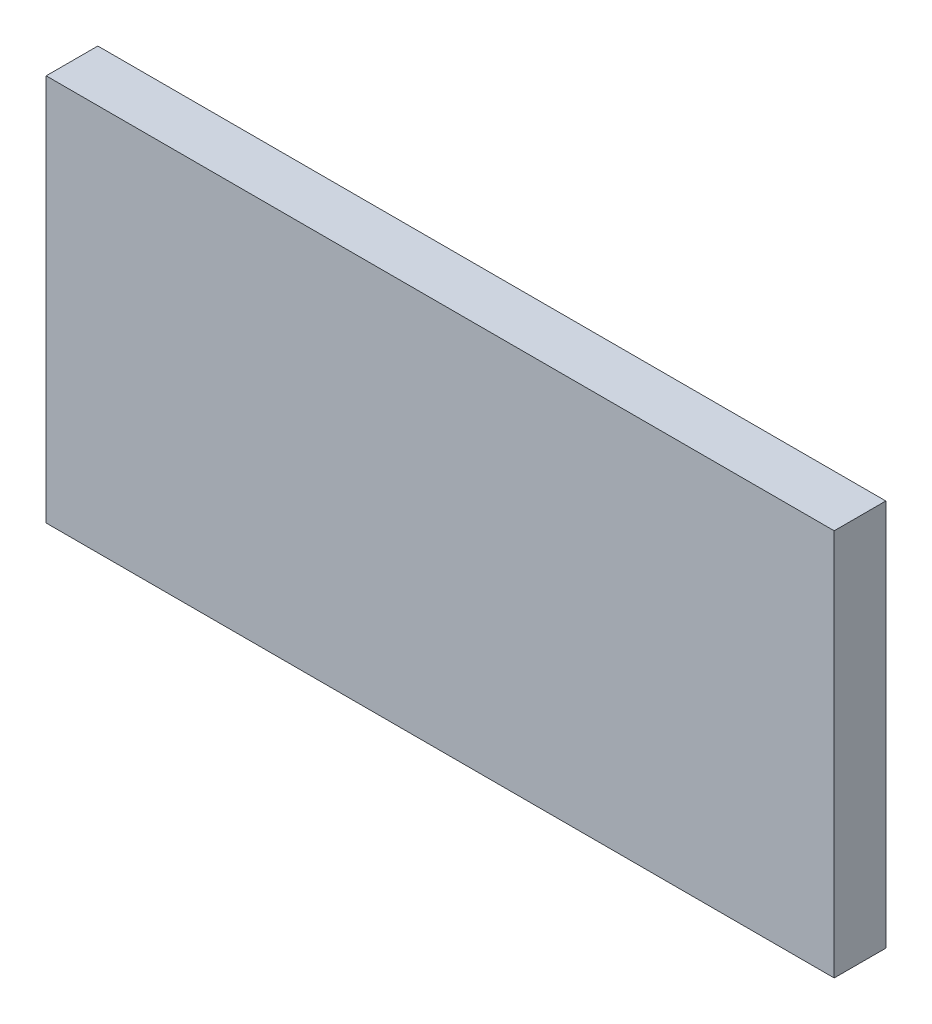
ISO-10303-21;
HEADER;
FILE_DESCRIPTION(('STEP AP214'),'2;1');
FILE_NAME('part.step','',(''),(''),'','','');
FILE_SCHEMA(('AUTOMOTIVE_DESIGN { 1 0 10303 214 1 1 1 1 }'));
ENDSEC;
DATA;
#1=APPLICATION_CONTEXT('core data for automotive mechanical design processes');
#2=APPLICATION_PROTOCOL_DEFINITION('international standard','automotive_design',2000,#1);
#3=PRODUCT_CONTEXT('',#1,'mechanical');
#4=PRODUCT('Part','Part','',(#3));
#5=PRODUCT_RELATED_PRODUCT_CATEGORY('part','',(#4));
#6=PRODUCT_DEFINITION_FORMATION('','',#4);
#7=PRODUCT_DEFINITION_CONTEXT('part definition',#1,'design');
#8=PRODUCT_DEFINITION('design','',#6,#7);
#9=PRODUCT_DEFINITION_SHAPE('','',#8);
#10=(LENGTH_UNIT() NAMED_UNIT(*) SI_UNIT(.MILLI.,.METRE.));
#11=(NAMED_UNIT(*) PLANE_ANGLE_UNIT() SI_UNIT($,.RADIAN.));
#12=(NAMED_UNIT(*) SI_UNIT($,.STERADIAN.) SOLID_ANGLE_UNIT());
#13=UNCERTAINTY_MEASURE_WITH_UNIT(LENGTH_MEASURE(1.E-05),#10,'distance_accuracy_value','');
#14=(GEOMETRIC_REPRESENTATION_CONTEXT(3) GLOBAL_UNCERTAINTY_ASSIGNED_CONTEXT((#13)) GLOBAL_UNIT_ASSIGNED_CONTEXT((#10,
#11,#12)) REPRESENTATION_CONTEXT('',''));
#15=CARTESIAN_POINT('',(0.,0.,0.));
#16=DIRECTION('',(0.,0.,1.));
#17=DIRECTION('',(1.,0.,0.));
#18=AXIS2_PLACEMENT_3D('',#15,#16,#17);
#19=CARTESIAN_POINT('',(30.5193647190363,-15.,4.));
#20=DIRECTION('',(-1.,0.,0.));
#21=DIRECTION('',(0.,0.,1.));
#22=AXIS2_PLACEMENT_3D('',#19,#20,#21);
#23=PLANE('',#22);
#24=DIRECTION('',(0.,1.,0.));
#25=VECTOR('',#24,1.);
#26=CARTESIAN_POINT('',(30.5193647190363,-15.,0.));
#27=LINE('',#26,#25);
#28=CARTESIAN_POINT('',(30.5193647190363,-15.,0.));
#29=VERTEX_POINT('',#28);
#30=CARTESIAN_POINT('',(30.5193647190363,15.,0.));
#31=VERTEX_POINT('',#30);
#32=EDGE_CURVE('E96',#29,#31,#27,.T.);
#33=ORIENTED_EDGE('',*,*,#32,.T.);
#34=DIRECTION('',(0.,0.,-1.));
#35=VECTOR('',#34,1.);
#36=CARTESIAN_POINT('',(30.5193647190363,15.,4.));
#37=LINE('',#36,#35);
#38=CARTESIAN_POINT('',(30.5193647190363,15.,4.));
#39=VERTEX_POINT('',#38);
#40=EDGE_CURVE('E11',#39,#31,#37,.T.);
#41=ORIENTED_EDGE('',*,*,#40,.F.);
#42=DIRECTION('',(0.,1.,0.));
#43=VECTOR('',#42,1.);
#44=CARTESIAN_POINT('',(30.5193647190363,-15.,4.));
#45=LINE('',#44,#43);
#46=CARTESIAN_POINT('',(30.5193647190363,-15.,4.));
#47=VERTEX_POINT('',#46);
#48=EDGE_CURVE('E84',#47,#39,#45,.T.);
#49=ORIENTED_EDGE('',*,*,#48,.F.);
#50=DIRECTION('',(0.,0.,-1.));
#51=VECTOR('',#50,1.);
#52=CARTESIAN_POINT('',(30.5193647190363,-15.,4.));
#53=LINE('',#52,#51);
#54=EDGE_CURVE('E92',#47,#29,#53,.T.);
#55=ORIENTED_EDGE('',*,*,#54,.T.);
#56=EDGE_LOOP('',(#33,#41,#49,#55));
#57=FACE_BOUND('',#56,.T.);
#58=ADVANCED_FACE('F33',(#57),#23,.F.);
#59=CARTESIAN_POINT('',(-30.5193647190363,15.,4.));
#60=DIRECTION('',(0.,-1.,0.));
#61=DIRECTION('',(0.,0.,-1.));
#62=AXIS2_PLACEMENT_3D('',#59,#60,#61);
#63=PLANE('',#62);
#64=DIRECTION('',(-1.,0.,0.));
#65=VECTOR('',#64,1.);
#66=CARTESIAN_POINT('',(-30.5193647190363,15.,0.));
#67=LINE('',#66,#65);
#68=CARTESIAN_POINT('',(-30.5193647190363,15.,0.));
#69=VERTEX_POINT('',#68);
#70=EDGE_CURVE('E88',#31,#69,#67,.T.);
#71=ORIENTED_EDGE('',*,*,#70,.T.);
#72=DIRECTION('',(0.,0.,-1.));
#73=VECTOR('',#72,1.);
#74=CARTESIAN_POINT('',(-30.5193647190363,15.,4.));
#75=LINE('',#74,#73);
#76=CARTESIAN_POINT('',(-30.5193647190363,15.,4.));
#77=VERTEX_POINT('',#76);
#78=EDGE_CURVE('E41',#77,#69,#75,.T.);
#79=ORIENTED_EDGE('',*,*,#78,.F.);
#80=DIRECTION('',(-1.,0.,0.));
#81=VECTOR('',#80,1.);
#82=CARTESIAN_POINT('',(-30.5193647190363,15.,4.));
#83=LINE('',#82,#81);
#84=EDGE_CURVE('E79',#39,#77,#83,.T.);
#85=ORIENTED_EDGE('',*,*,#84,.F.);
#86=ORIENTED_EDGE('',*,*,#40,.T.);
#87=EDGE_LOOP('',(#71,#79,#85,#86));
#88=FACE_BOUND('',#87,.T.);
#89=ADVANCED_FACE('F87',(#88),#63,.F.);
#90=CARTESIAN_POINT('',(-30.5193647190363,-15.,4.));
#91=DIRECTION('',(1.,0.,0.));
#92=DIRECTION('',(0.,0.,-1.));
#93=AXIS2_PLACEMENT_3D('',#90,#91,#92);
#94=PLANE('',#93);
#95=DIRECTION('',(0.,-1.,0.));
#96=VECTOR('',#95,1.);
#97=CARTESIAN_POINT('',(-30.5193647190363,-15.,0.));
#98=LINE('',#97,#96);
#99=CARTESIAN_POINT('',(-30.5193647190363,-15.,0.));
#100=VERTEX_POINT('',#99);
#101=EDGE_CURVE('E66',#69,#100,#98,.T.);
#102=ORIENTED_EDGE('',*,*,#101,.T.);
#103=DIRECTION('',(0.,0.,-1.));
#104=VECTOR('',#103,1.);
#105=CARTESIAN_POINT('',(-30.5193647190363,-15.,4.));
#106=LINE('',#105,#104);
#107=CARTESIAN_POINT('',(-30.5193647190363,-15.,4.));
#108=VERTEX_POINT('',#107);
#109=EDGE_CURVE('E89',#108,#100,#106,.T.);
#110=ORIENTED_EDGE('',*,*,#109,.F.);
#111=DIRECTION('',(0.,-1.,0.));
#112=VECTOR('',#111,1.);
#113=CARTESIAN_POINT('',(-30.5193647190363,-15.,4.));
#114=LINE('',#113,#112);
#115=EDGE_CURVE('E82',#77,#108,#114,.T.);
#116=ORIENTED_EDGE('',*,*,#115,.F.);
#117=ORIENTED_EDGE('',*,*,#78,.T.);
#118=EDGE_LOOP('',(#102,#110,#116,#117));
#119=FACE_BOUND('',#118,.T.);
#120=ADVANCED_FACE('F90',(#119),#94,.F.);
#121=CARTESIAN_POINT('',(-30.5193647190363,-15.,4.));
#122=DIRECTION('',(0.,1.,0.));
#123=DIRECTION('',(0.,0.,1.));
#124=AXIS2_PLACEMENT_3D('',#121,#122,#123);
#125=PLANE('',#124);
#126=DIRECTION('',(1.,0.,0.));
#127=VECTOR('',#126,1.);
#128=CARTESIAN_POINT('',(-30.5193647190363,-15.,0.));
#129=LINE('',#128,#127);
#130=EDGE_CURVE('E72',#100,#29,#129,.T.);
#131=ORIENTED_EDGE('',*,*,#130,.T.);
#132=ORIENTED_EDGE('',*,*,#54,.F.);
#133=DIRECTION('',(1.,0.,0.));
#134=VECTOR('',#133,1.);
#135=CARTESIAN_POINT('',(-30.5193647190363,-15.,4.));
#136=LINE('',#135,#134);
#137=EDGE_CURVE('E49',#108,#47,#136,.T.);
#138=ORIENTED_EDGE('',*,*,#137,.F.);
#139=ORIENTED_EDGE('',*,*,#109,.T.);
#140=EDGE_LOOP('',(#131,#132,#138,#139));
#141=FACE_BOUND('',#140,.T.);
#142=ADVANCED_FACE('F103',(#141),#125,.F.);
#143=CARTESIAN_POINT('',(0.,0.,4.));
#144=DIRECTION('',(0.,0.,-1.));
#145=DIRECTION('',(-1.,0.,0.));
#146=AXIS2_PLACEMENT_3D('',#143,#144,#145);
#147=PLANE('',#146);
#148=ORIENTED_EDGE('',*,*,#48,.T.);
#149=ORIENTED_EDGE('',*,*,#84,.T.);
#150=ORIENTED_EDGE('',*,*,#115,.T.);
#151=ORIENTED_EDGE('',*,*,#137,.T.);
#152=EDGE_LOOP('',(#148,#149,#150,#151));
#153=FACE_BOUND('',#152,.T.);
#154=ADVANCED_FACE('F80',(#153),#147,.F.);
#155=CARTESIAN_POINT('',(0.,0.,0.));
#156=DIRECTION('',(0.,0.,-1.));
#157=DIRECTION('',(-1.,0.,0.));
#158=AXIS2_PLACEMENT_3D('',#155,#156,#157);
#159=PLANE('',#158);
#160=ORIENTED_EDGE('',*,*,#32,.F.);
#161=ORIENTED_EDGE('',*,*,#130,.F.);
#162=ORIENTED_EDGE('',*,*,#101,.F.);
#163=ORIENTED_EDGE('',*,*,#70,.F.);
#164=EDGE_LOOP('',(#160,#161,#162,#163));
#165=FACE_BOUND('',#164,.T.);
#166=ADVANCED_FACE('F106',(#165),#159,.T.);
#167=CLOSED_SHELL('',(#58,#89,#120,#142,#154,#166));
#168=MANIFOLD_SOLID_BREP('B2',#167);
#169=ADVANCED_BREP_SHAPE_REPRESENTATION('',(#18,#168),#14);
#170=SHAPE_DEFINITION_REPRESENTATION(#9,#169);
ENDSEC;
END-ISO-10303-21;
